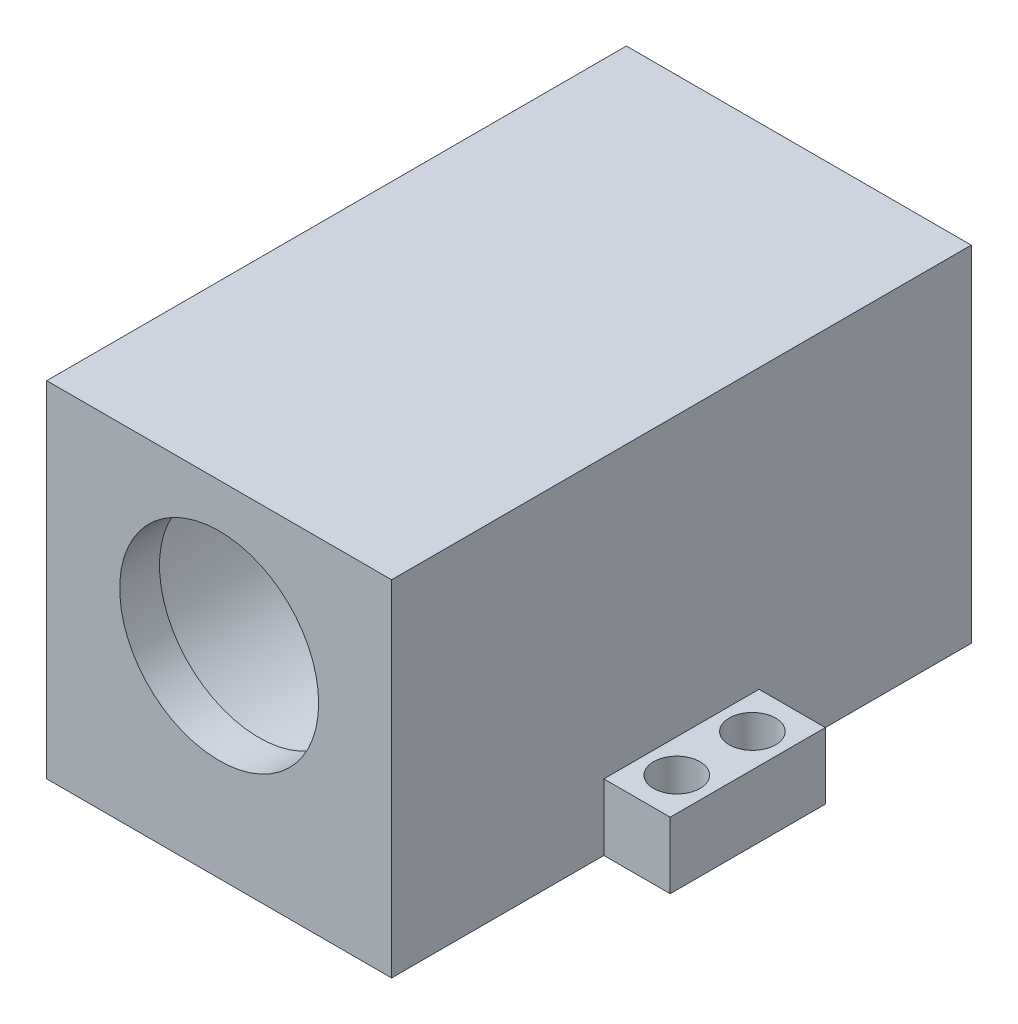
ISO-10303-21;
HEADER;
FILE_DESCRIPTION(('STEP AP214'),'2;1');
FILE_NAME('part.step','',(''),(''),'','','');
FILE_SCHEMA(('AUTOMOTIVE_DESIGN { 1 0 10303 214 1 1 1 1 }'));
ENDSEC;
DATA;
#1=APPLICATION_CONTEXT('core data for automotive mechanical design processes');
#2=APPLICATION_PROTOCOL_DEFINITION('international standard','automotive_design',2000,#1);
#3=PRODUCT_CONTEXT('',#1,'mechanical');
#4=PRODUCT('Part','Part','',(#3));
#5=PRODUCT_RELATED_PRODUCT_CATEGORY('part','',(#4));
#6=PRODUCT_DEFINITION_FORMATION('','',#4);
#7=PRODUCT_DEFINITION_CONTEXT('part definition',#1,'design');
#8=PRODUCT_DEFINITION('design','',#6,#7);
#9=PRODUCT_DEFINITION_SHAPE('','',#8);
#10=(LENGTH_UNIT() NAMED_UNIT(*) SI_UNIT(.MILLI.,.METRE.));
#11=(NAMED_UNIT(*) PLANE_ANGLE_UNIT() SI_UNIT($,.RADIAN.));
#12=(NAMED_UNIT(*) SI_UNIT($,.STERADIAN.) SOLID_ANGLE_UNIT());
#13=UNCERTAINTY_MEASURE_WITH_UNIT(LENGTH_MEASURE(1.E-05),#10,'distance_accuracy_value','');
#14=(GEOMETRIC_REPRESENTATION_CONTEXT(3) GLOBAL_UNCERTAINTY_ASSIGNED_CONTEXT((#13)) GLOBAL_UNIT_ASSIGNED_CONTEXT((#10,
#11,#12)) REPRESENTATION_CONTEXT('',''));
#15=CARTESIAN_POINT('',(0.,0.,0.));
#16=DIRECTION('',(0.,0.,1.));
#17=DIRECTION('',(1.,0.,0.));
#18=AXIS2_PLACEMENT_3D('',#15,#16,#17);
#19=CARTESIAN_POINT('',(13.,10.81,40.7));
#20=DIRECTION('',(-1.,0.,0.));
#21=DIRECTION('',(0.,-1.,0.));
#22=AXIS2_PLACEMENT_3D('',#19,#20,#21);
#23=PLANE('',#22);
#24=DIRECTION('',(0.,-1.,0.));
#25=VECTOR('',#24,1.);
#26=CARTESIAN_POINT('',(13.,-15.19,27.7));
#27=LINE('',#26,#25);
#28=CARTESIAN_POINT('',(13.,-10.19,27.7));
#29=VERTEX_POINT('',#28);
#30=CARTESIAN_POINT('',(13.,-15.19,27.7));
#31=VERTEX_POINT('',#30);
#32=EDGE_CURVE('E50',#29,#31,#27,.T.);
#33=ORIENTED_EDGE('',*,*,#32,.F.);
#34=DIRECTION('',(0.,0.,1.));
#35=VECTOR('',#34,1.);
#36=CARTESIAN_POINT('',(13.,-10.19,27.7));
#37=LINE('',#36,#35);
#38=CARTESIAN_POINT('',(13.,-10.19,16.));
#39=VERTEX_POINT('',#38);
#40=EDGE_CURVE('E143',#39,#29,#37,.T.);
#41=ORIENTED_EDGE('',*,*,#40,.F.);
#42=DIRECTION('',(0.,1.,0.));
#43=VECTOR('',#42,1.);
#44=CARTESIAN_POINT('',(13.,-15.19,16.));
#45=LINE('',#44,#43);
#46=CARTESIAN_POINT('',(13.,-15.19,16.));
#47=VERTEX_POINT('',#46);
#48=EDGE_CURVE('E56',#47,#39,#45,.T.);
#49=ORIENTED_EDGE('',*,*,#48,.F.);
#50=DIRECTION('',(0.,0.,-1.));
#51=VECTOR('',#50,1.);
#52=CARTESIAN_POINT('',(13.,-15.19,40.7));
#53=LINE('',#52,#51);
#54=CARTESIAN_POINT('',(13.,-15.19,0.));
#55=VERTEX_POINT('',#54);
#56=EDGE_CURVE('E225',#47,#55,#53,.T.);
#57=ORIENTED_EDGE('',*,*,#56,.T.);
#58=DIRECTION('',(0.,1.,0.));
#59=VECTOR('',#58,1.);
#60=CARTESIAN_POINT('',(13.,10.81,0.));
#61=LINE('',#60,#59);
#62=CARTESIAN_POINT('',(13.,10.81,0.));
#63=VERTEX_POINT('',#62);
#64=EDGE_CURVE('E215',#55,#63,#61,.T.);
#65=ORIENTED_EDGE('',*,*,#64,.T.);
#66=DIRECTION('',(0.,0.,-1.));
#67=VECTOR('',#66,1.);
#68=CARTESIAN_POINT('',(13.,10.81,40.7));
#69=LINE('',#68,#67);
#70=CARTESIAN_POINT('',(13.,10.81,43.7));
#71=VERTEX_POINT('',#70);
#72=EDGE_CURVE('E11',#71,#63,#69,.T.);
#73=ORIENTED_EDGE('',*,*,#72,.F.);
#74=DIRECTION('',(0.,1.,0.));
#75=VECTOR('',#74,1.);
#76=CARTESIAN_POINT('',(13.,10.81,43.7));
#77=LINE('',#76,#75);
#78=CARTESIAN_POINT('',(13.,-15.19,43.7));
#79=VERTEX_POINT('',#78);
#80=EDGE_CURVE('E203',#79,#71,#77,.T.);
#81=ORIENTED_EDGE('',*,*,#80,.F.);
#82=EDGE_CURVE('E226',#79,#31,#53,.T.);
#83=ORIENTED_EDGE('',*,*,#82,.T.);
#84=EDGE_LOOP('',(#33,#41,#49,#57,#65,#73,#81,#83));
#85=FACE_BOUND('',#84,.T.);
#86=ADVANCED_FACE('F36',(#85),#23,.F.);
#87=CARTESIAN_POINT('',(-13.,10.81,40.7));
#88=DIRECTION('',(1.,0.,0.));
#89=DIRECTION('',(0.,1.,0.));
#90=AXIS2_PLACEMENT_3D('',#87,#88,#89);
#91=PLANE('',#90);
#92=DIRECTION('',(0.,1.,0.));
#93=VECTOR('',#92,1.);
#94=CARTESIAN_POINT('',(-13.,-15.19,27.7));
#95=LINE('',#94,#93);
#96=CARTESIAN_POINT('',(-13.,-15.19,27.7));
#97=VERTEX_POINT('',#96);
#98=CARTESIAN_POINT('',(-13.,-10.19,27.7));
#99=VERTEX_POINT('',#98);
#100=EDGE_CURVE('E178',#97,#99,#95,.T.);
#101=ORIENTED_EDGE('',*,*,#100,.F.);
#102=DIRECTION('',(0.,0.,-1.));
#103=VECTOR('',#102,1.);
#104=CARTESIAN_POINT('',(-13.,-15.19,40.7));
#105=LINE('',#104,#103);
#106=CARTESIAN_POINT('',(-13.,-15.19,43.7));
#107=VERTEX_POINT('',#106);
#108=EDGE_CURVE('E229',#107,#97,#105,.T.);
#109=ORIENTED_EDGE('',*,*,#108,.F.);
#110=DIRECTION('',(0.,-1.,0.));
#111=VECTOR('',#110,1.);
#112=CARTESIAN_POINT('',(-13.,10.81,43.7));
#113=LINE('',#112,#111);
#114=CARTESIAN_POINT('',(-13.,10.81,43.7));
#115=VERTEX_POINT('',#114);
#116=EDGE_CURVE('E195',#115,#107,#113,.T.);
#117=ORIENTED_EDGE('',*,*,#116,.F.);
#118=DIRECTION('',(0.,0.,-1.));
#119=VECTOR('',#118,1.);
#120=CARTESIAN_POINT('',(-13.,10.81,40.7));
#121=LINE('',#120,#119);
#122=CARTESIAN_POINT('',(-13.,10.81,0.));
#123=VERTEX_POINT('',#122);
#124=EDGE_CURVE('E43',#115,#123,#121,.T.);
#125=ORIENTED_EDGE('',*,*,#124,.T.);
#126=DIRECTION('',(0.,-1.,0.));
#127=VECTOR('',#126,1.);
#128=CARTESIAN_POINT('',(-13.,10.81,0.));
#129=LINE('',#128,#127);
#130=CARTESIAN_POINT('',(-13.,-15.19,0.));
#131=VERTEX_POINT('',#130);
#132=EDGE_CURVE('E220',#123,#131,#129,.T.);
#133=ORIENTED_EDGE('',*,*,#132,.T.);
#134=CARTESIAN_POINT('',(-13.,-15.19,16.));
#135=VERTEX_POINT('',#134);
#136=EDGE_CURVE('E228',#135,#131,#105,.T.);
#137=ORIENTED_EDGE('',*,*,#136,.F.);
#138=DIRECTION('',(0.,1.,0.));
#139=VECTOR('',#138,1.);
#140=CARTESIAN_POINT('',(-13.,-15.19,16.));
#141=LINE('',#140,#139);
#142=CARTESIAN_POINT('',(-13.,-10.19,16.));
#143=VERTEX_POINT('',#142);
#144=EDGE_CURVE('E168',#135,#143,#141,.T.);
#145=ORIENTED_EDGE('',*,*,#144,.T.);
#146=DIRECTION('',(0.,0.,1.));
#147=VECTOR('',#146,1.);
#148=CARTESIAN_POINT('',(-13.,-10.19,16.));
#149=LINE('',#148,#147);
#150=EDGE_CURVE('E158',#143,#99,#149,.T.);
#151=ORIENTED_EDGE('',*,*,#150,.T.);
#152=EDGE_LOOP('',(#101,#109,#117,#125,#133,#137,#145,#151));
#153=FACE_BOUND('',#152,.T.);
#154=ADVANCED_FACE('F236',(#153),#91,.F.);
#155=CARTESIAN_POINT('',(0.,0.,0.));
#156=DIRECTION('',(0.,0.,-1.));
#157=DIRECTION('',(-1.,0.,0.));
#158=AXIS2_PLACEMENT_3D('',#155,#156,#157);
#159=PLANE('',#158);
#160=ORIENTED_EDGE('',*,*,#64,.F.);
#161=DIRECTION('',(1.,0.,0.));
#162=VECTOR('',#161,1.);
#163=CARTESIAN_POINT('',(13.,-15.19,0.));
#164=LINE('',#163,#162);
#165=EDGE_CURVE('E223',#131,#55,#164,.T.);
#166=ORIENTED_EDGE('',*,*,#165,.F.);
#167=ORIENTED_EDGE('',*,*,#132,.F.);
#168=DIRECTION('',(-1.,0.,0.));
#169=VECTOR('',#168,1.);
#170=CARTESIAN_POINT('',(13.,10.81,0.));
#171=LINE('',#170,#169);
#172=EDGE_CURVE('E218',#63,#123,#171,.T.);
#173=ORIENTED_EDGE('',*,*,#172,.F.);
#174=EDGE_LOOP('',(#160,#166,#167,#173));
#175=FACE_BOUND('',#174,.T.);
#176=CARTESIAN_POINT('',(0.,0.,0.));
#177=DIRECTION('',(0.,0.,1.));
#178=DIRECTION('',(1.,0.,0.));
#179=AXIS2_PLACEMENT_3D('',#176,#177,#178);
#180=CIRCLE('',#179,10.6);
#181=CARTESIAN_POINT('',(10.6,0.,0.));
#182=VERTEX_POINT('',#181);
#183=EDGE_CURVE('E212',#182,#182,#180,.T.);
#184=ORIENTED_EDGE('',*,*,#183,.T.);
#185=EDGE_LOOP('',(#184));
#186=FACE_BOUND('',#185,.T.);
#187=ADVANCED_FACE('F243',(#175,#186),#159,.T.);
#188=CARTESIAN_POINT('',(13.,10.81,40.7));
#189=DIRECTION('',(0.,-1.,0.));
#190=DIRECTION('',(1.,0.,0.));
#191=AXIS2_PLACEMENT_3D('',#188,#189,#190);
#192=PLANE('',#191);
#193=ORIENTED_EDGE('',*,*,#172,.T.);
#194=ORIENTED_EDGE('',*,*,#124,.F.);
#195=DIRECTION('',(-1.,0.,0.));
#196=VECTOR('',#195,1.);
#197=CARTESIAN_POINT('',(-13.,10.81,43.7));
#198=LINE('',#197,#196);
#199=EDGE_CURVE('E206',#71,#115,#198,.T.);
#200=ORIENTED_EDGE('',*,*,#199,.F.);
#201=ORIENTED_EDGE('',*,*,#72,.T.);
#202=EDGE_LOOP('',(#193,#194,#200,#201));
#203=FACE_BOUND('',#202,.T.);
#204=ADVANCED_FACE('F265',(#203),#192,.F.);
#205=CARTESIAN_POINT('',(13.,-15.19,40.7));
#206=DIRECTION('',(0.,1.,0.));
#207=DIRECTION('',(-1.,0.,0.));
#208=AXIS2_PLACEMENT_3D('',#205,#206,#207);
#209=PLANE('',#208);
#210=CARTESIAN_POINT('',(15.5,-15.19,19.));
#211=DIRECTION('',(0.,1.,0.));
#212=DIRECTION('',(-1.,0.,0.));
#213=AXIS2_PLACEMENT_3D('',#210,#211,#212);
#214=CIRCLE('',#213,1.75);
#215=CARTESIAN_POINT('',(13.75,-15.19,19.));
#216=VERTEX_POINT('',#215);
#217=EDGE_CURVE('E291',#216,#216,#214,.T.);
#218=ORIENTED_EDGE('',*,*,#217,.T.);
#219=EDGE_LOOP('',(#218));
#220=FACE_BOUND('',#219,.T.);
#221=CARTESIAN_POINT('',(15.5,-15.19,24.7));
#222=DIRECTION('',(0.,1.,0.));
#223=DIRECTION('',(-1.,0.,0.));
#224=AXIS2_PLACEMENT_3D('',#221,#222,#223);
#225=CIRCLE('',#224,1.75);
#226=CARTESIAN_POINT('',(13.75,-15.19,24.7));
#227=VERTEX_POINT('',#226);
#228=EDGE_CURVE('E295',#227,#227,#225,.T.);
#229=ORIENTED_EDGE('',*,*,#228,.T.);
#230=EDGE_LOOP('',(#229));
#231=FACE_BOUND('',#230,.T.);
#232=CARTESIAN_POINT('',(-15.4500463106623,-15.19,19.));
#233=DIRECTION('',(0.,1.,0.));
#234=DIRECTION('',(-1.,0.,0.));
#235=AXIS2_PLACEMENT_3D('',#232,#233,#234);
#236=CIRCLE('',#235,1.75);
#237=CARTESIAN_POINT('',(-17.2000463106623,-15.19,19.));
#238=VERTEX_POINT('',#237);
#239=EDGE_CURVE('E155',#238,#238,#236,.T.);
#240=ORIENTED_EDGE('',*,*,#239,.T.);
#241=EDGE_LOOP('',(#240));
#242=FACE_BOUND('',#241,.T.);
#243=CARTESIAN_POINT('',(-15.4500463106623,-15.19,24.7));
#244=DIRECTION('',(0.,1.,0.));
#245=DIRECTION('',(-1.,0.,0.));
#246=AXIS2_PLACEMENT_3D('',#243,#244,#245);
#247=CIRCLE('',#246,1.75);
#248=CARTESIAN_POINT('',(-17.2000463106623,-15.19,24.7));
#249=VERTEX_POINT('',#248);
#250=EDGE_CURVE('E146',#249,#249,#247,.T.);
#251=ORIENTED_EDGE('',*,*,#250,.T.);
#252=EDGE_LOOP('',(#251));
#253=FACE_BOUND('',#252,.T.);
#254=ORIENTED_EDGE('',*,*,#165,.T.);
#255=ORIENTED_EDGE('',*,*,#56,.F.);
#256=DIRECTION('',(-1.,0.,0.));
#257=VECTOR('',#256,1.);
#258=CARTESIAN_POINT('',(18.,-15.19,16.));
#259=LINE('',#258,#257);
#260=CARTESIAN_POINT('',(18.,-15.19,16.));
#261=VERTEX_POINT('',#260);
#262=EDGE_CURVE('E130',#261,#47,#259,.T.);
#263=ORIENTED_EDGE('',*,*,#262,.F.);
#264=DIRECTION('',(0.,0.,-1.));
#265=VECTOR('',#264,1.);
#266=CARTESIAN_POINT('',(18.,-15.19,27.7));
#267=LINE('',#266,#265);
#268=CARTESIAN_POINT('',(18.,-15.19,27.7));
#269=VERTEX_POINT('',#268);
#270=EDGE_CURVE('E123',#269,#261,#267,.T.);
#271=ORIENTED_EDGE('',*,*,#270,.F.);
#272=DIRECTION('',(-1.,0.,0.));
#273=VECTOR('',#272,1.);
#274=CARTESIAN_POINT('',(18.,-15.19,27.7));
#275=LINE('',#274,#273);
#276=EDGE_CURVE('E128',#269,#31,#275,.T.);
#277=ORIENTED_EDGE('',*,*,#276,.T.);
#278=ORIENTED_EDGE('',*,*,#82,.F.);
#279=DIRECTION('',(1.,0.,0.));
#280=VECTOR('',#279,1.);
#281=CARTESIAN_POINT('',(-13.,-15.19,43.7));
#282=LINE('',#281,#280);
#283=EDGE_CURVE('E200',#107,#79,#282,.T.);
#284=ORIENTED_EDGE('',*,*,#283,.F.);
#285=ORIENTED_EDGE('',*,*,#108,.T.);
#286=DIRECTION('',(1.,0.,0.));
#287=VECTOR('',#286,1.);
#288=CARTESIAN_POINT('',(-18.,-15.19,27.7));
#289=LINE('',#288,#287);
#290=CARTESIAN_POINT('',(-18.,-15.19,27.7));
#291=VERTEX_POINT('',#290);
#292=EDGE_CURVE('E189',#291,#97,#289,.T.);
#293=ORIENTED_EDGE('',*,*,#292,.F.);
#294=DIRECTION('',(0.,0.,1.));
#295=VECTOR('',#294,1.);
#296=CARTESIAN_POINT('',(-18.,-15.19,16.));
#297=LINE('',#296,#295);
#298=CARTESIAN_POINT('',(-18.,-15.19,16.));
#299=VERTEX_POINT('',#298);
#300=EDGE_CURVE('E170',#299,#291,#297,.T.);
#301=ORIENTED_EDGE('',*,*,#300,.F.);
#302=DIRECTION('',(1.,0.,0.));
#303=VECTOR('',#302,1.);
#304=CARTESIAN_POINT('',(-18.,-15.19,16.));
#305=LINE('',#304,#303);
#306=EDGE_CURVE('E187',#299,#135,#305,.T.);
#307=ORIENTED_EDGE('',*,*,#306,.T.);
#308=ORIENTED_EDGE('',*,*,#136,.T.);
#309=EDGE_LOOP('',(#254,#255,#263,#271,#277,#278,#284,#285,#293,#301,#307,#308));
#310=FACE_BOUND('',#309,.T.);
#311=ADVANCED_FACE('F126',(#220,#231,#242,#253,#310),#209,.F.);
#312=CARTESIAN_POINT('',(0.,0.,40.7));
#313=DIRECTION('',(0.,0.,-1.));
#314=DIRECTION('',(-1.,0.,0.));
#315=AXIS2_PLACEMENT_3D('',#312,#313,#314);
#316=CYLINDRICAL_SURFACE('',#315,10.6);
#317=CARTESIAN_POINT('',(0.,0.,40.7));
#318=DIRECTION('',(0.,0.,1.));
#319=DIRECTION('',(1.,0.,0.));
#320=AXIS2_PLACEMENT_3D('',#317,#318,#319);
#321=CIRCLE('',#320,10.6);
#322=CARTESIAN_POINT('',(10.6,0.,40.7));
#323=VERTEX_POINT('',#322);
#324=EDGE_CURVE('E209',#323,#323,#321,.T.);
#325=ORIENTED_EDGE('',*,*,#324,.T.);
#326=EDGE_LOOP('',(#325));
#327=FACE_BOUND('',#326,.T.);
#328=ORIENTED_EDGE('',*,*,#183,.F.);
#329=EDGE_LOOP('',(#328));
#330=FACE_BOUND('',#329,.T.);
#331=ADVANCED_FACE('F280',(#327,#330),#316,.F.);
#332=CARTESIAN_POINT('',(0.,0.,40.7));
#333=DIRECTION('',(0.,0.,1.));
#334=DIRECTION('',(1.,0.,0.));
#335=AXIS2_PLACEMENT_3D('',#332,#333,#334);
#336=PLANE('',#335);
#337=CARTESIAN_POINT('',(0.,0.,40.7));
#338=DIRECTION('',(0.,0.,1.));
#339=DIRECTION('',(1.,0.,0.));
#340=AXIS2_PLACEMENT_3D('',#337,#338,#339);
#341=CIRCLE('',#340,7.5);
#342=CARTESIAN_POINT('',(7.5,0.,40.7));
#343=VERTEX_POINT('',#342);
#344=EDGE_CURVE('E186',#343,#343,#341,.T.);
#345=ORIENTED_EDGE('',*,*,#344,.T.);
#346=EDGE_LOOP('',(#345));
#347=FACE_BOUND('',#346,.T.);
#348=ORIENTED_EDGE('',*,*,#324,.F.);
#349=EDGE_LOOP('',(#348));
#350=FACE_BOUND('',#349,.T.);
#351=ADVANCED_FACE('F285',(#347,#350),#336,.F.);
#352=CARTESIAN_POINT('',(0.,0.,43.7));
#353=DIRECTION('',(0.,0.,1.));
#354=DIRECTION('',(1.,0.,0.));
#355=AXIS2_PLACEMENT_3D('',#352,#353,#354);
#356=PLANE('',#355);
#357=ORIENTED_EDGE('',*,*,#116,.T.);
#358=ORIENTED_EDGE('',*,*,#283,.T.);
#359=ORIENTED_EDGE('',*,*,#80,.T.);
#360=ORIENTED_EDGE('',*,*,#199,.T.);
#361=EDGE_LOOP('',(#357,#358,#359,#360));
#362=FACE_BOUND('',#361,.T.);
#363=CARTESIAN_POINT('',(0.,0.,43.7));
#364=DIRECTION('',(0.,0.,1.));
#365=DIRECTION('',(1.,0.,0.));
#366=AXIS2_PLACEMENT_3D('',#363,#364,#365);
#367=CIRCLE('',#366,7.5);
#368=CARTESIAN_POINT('',(7.5,0.,43.7));
#369=VERTEX_POINT('',#368);
#370=EDGE_CURVE('E192',#369,#369,#367,.T.);
#371=ORIENTED_EDGE('',*,*,#370,.F.);
#372=EDGE_LOOP('',(#371));
#373=FACE_BOUND('',#372,.T.);
#374=ADVANCED_FACE('F263',(#362,#373),#356,.T.);
#375=CARTESIAN_POINT('',(0.,0.,43.7));
#376=DIRECTION('',(0.,0.,-1.));
#377=DIRECTION('',(-1.,0.,0.));
#378=AXIS2_PLACEMENT_3D('',#375,#376,#377);
#379=CYLINDRICAL_SURFACE('',#378,7.5);
#380=ORIENTED_EDGE('',*,*,#370,.T.);
#381=EDGE_LOOP('',(#380));
#382=FACE_BOUND('',#381,.T.);
#383=ORIENTED_EDGE('',*,*,#344,.F.);
#384=EDGE_LOOP('',(#383));
#385=FACE_BOUND('',#384,.T.);
#386=ADVANCED_FACE('F308',(#382,#385),#379,.F.);
#387=CARTESIAN_POINT('',(-18.,-10.19,16.));
#388=DIRECTION('',(0.,1.,0.));
#389=DIRECTION('',(-1.,0.,0.));
#390=AXIS2_PLACEMENT_3D('',#387,#388,#389);
#391=PLANE('',#390);
#392=CARTESIAN_POINT('',(-15.4500463106623,-10.19,19.));
#393=DIRECTION('',(0.,1.,0.));
#394=DIRECTION('',(-1.,0.,0.));
#395=AXIS2_PLACEMENT_3D('',#392,#393,#394);
#396=CIRCLE('',#395,1.75);
#397=CARTESIAN_POINT('',(-17.2000463106623,-10.19,19.));
#398=VERTEX_POINT('',#397);
#399=EDGE_CURVE('E159',#398,#398,#396,.T.);
#400=ORIENTED_EDGE('',*,*,#399,.F.);
#401=EDGE_LOOP('',(#400));
#402=FACE_BOUND('',#401,.T.);
#403=CARTESIAN_POINT('',(-15.4500463106623,-10.19,24.7));
#404=DIRECTION('',(0.,1.,0.));
#405=DIRECTION('',(-1.,0.,0.));
#406=AXIS2_PLACEMENT_3D('',#403,#404,#405);
#407=CIRCLE('',#406,1.75);
#408=CARTESIAN_POINT('',(-17.2000463106623,-10.19,24.7));
#409=VERTEX_POINT('',#408);
#410=EDGE_CURVE('E149',#409,#409,#407,.T.);
#411=ORIENTED_EDGE('',*,*,#410,.F.);
#412=EDGE_LOOP('',(#411));
#413=FACE_BOUND('',#412,.T.);
#414=ORIENTED_EDGE('',*,*,#150,.F.);
#415=DIRECTION('',(1.,0.,0.));
#416=VECTOR('',#415,1.);
#417=CARTESIAN_POINT('',(-18.,-10.19,16.));
#418=LINE('',#417,#416);
#419=CARTESIAN_POINT('',(-18.,-10.19,16.));
#420=VERTEX_POINT('',#419);
#421=EDGE_CURVE('E183',#420,#143,#418,.T.);
#422=ORIENTED_EDGE('',*,*,#421,.F.);
#423=DIRECTION('',(0.,0.,1.));
#424=VECTOR('',#423,1.);
#425=CARTESIAN_POINT('',(-18.,-10.19,16.));
#426=LINE('',#425,#424);
#427=CARTESIAN_POINT('',(-18.,-10.19,27.7));
#428=VERTEX_POINT('',#427);
#429=EDGE_CURVE('E164',#420,#428,#426,.T.);
#430=ORIENTED_EDGE('',*,*,#429,.T.);
#431=DIRECTION('',(1.,0.,0.));
#432=VECTOR('',#431,1.);
#433=CARTESIAN_POINT('',(-18.,-10.19,27.7));
#434=LINE('',#433,#432);
#435=EDGE_CURVE('E175',#428,#99,#434,.T.);
#436=ORIENTED_EDGE('',*,*,#435,.T.);
#437=EDGE_LOOP('',(#414,#422,#430,#436));
#438=FACE_BOUND('',#437,.T.);
#439=ADVANCED_FACE('F252',(#402,#413,#438),#391,.T.);
#440=CARTESIAN_POINT('',(-18.,-15.19,16.));
#441=DIRECTION('',(0.,0.,-1.));
#442=DIRECTION('',(-1.,0.,0.));
#443=AXIS2_PLACEMENT_3D('',#440,#441,#442);
#444=PLANE('',#443);
#445=ORIENTED_EDGE('',*,*,#144,.F.);
#446=ORIENTED_EDGE('',*,*,#306,.F.);
#447=DIRECTION('',(0.,1.,0.));
#448=VECTOR('',#447,1.);
#449=CARTESIAN_POINT('',(-18.,-15.19,16.));
#450=LINE('',#449,#448);
#451=EDGE_CURVE('E172',#299,#420,#450,.T.);
#452=ORIENTED_EDGE('',*,*,#451,.T.);
#453=ORIENTED_EDGE('',*,*,#421,.T.);
#454=EDGE_LOOP('',(#445,#446,#452,#453));
#455=FACE_BOUND('',#454,.T.);
#456=ADVANCED_FACE('F248',(#455),#444,.T.);
#457=CARTESIAN_POINT('',(-18.,-15.19,27.7));
#458=DIRECTION('',(0.,0.,-1.));
#459=DIRECTION('',(-1.,0.,0.));
#460=AXIS2_PLACEMENT_3D('',#457,#458,#459);
#461=PLANE('',#460);
#462=ORIENTED_EDGE('',*,*,#100,.T.);
#463=ORIENTED_EDGE('',*,*,#435,.F.);
#464=DIRECTION('',(0.,1.,0.));
#465=VECTOR('',#464,1.);
#466=CARTESIAN_POINT('',(-18.,-15.19,27.7));
#467=LINE('',#466,#465);
#468=EDGE_CURVE('E167',#291,#428,#467,.T.);
#469=ORIENTED_EDGE('',*,*,#468,.F.);
#470=ORIENTED_EDGE('',*,*,#292,.T.);
#471=EDGE_LOOP('',(#462,#463,#469,#470));
#472=FACE_BOUND('',#471,.T.);
#473=ADVANCED_FACE('F259',(#472),#461,.F.);
#474=CARTESIAN_POINT('',(-18.,0.,0.));
#475=DIRECTION('',(-1.,0.,0.));
#476=DIRECTION('',(0.,0.,1.));
#477=AXIS2_PLACEMENT_3D('',#474,#475,#476);
#478=PLANE('',#477);
#479=ORIENTED_EDGE('',*,*,#429,.F.);
#480=ORIENTED_EDGE('',*,*,#451,.F.);
#481=ORIENTED_EDGE('',*,*,#300,.T.);
#482=ORIENTED_EDGE('',*,*,#468,.T.);
#483=EDGE_LOOP('',(#479,#480,#481,#482));
#484=FACE_BOUND('',#483,.T.);
#485=ADVANCED_FACE('F254',(#484),#478,.T.);
#486=CARTESIAN_POINT('',(-15.4500463106623,-15.19,24.7));
#487=DIRECTION('',(0.,1.,0.));
#488=DIRECTION('',(-1.,0.,0.));
#489=AXIS2_PLACEMENT_3D('',#486,#487,#488);
#490=CYLINDRICAL_SURFACE('',#489,1.75);
#491=ORIENTED_EDGE('',*,*,#250,.F.);
#492=EDGE_LOOP('',(#491));
#493=FACE_BOUND('',#492,.T.);
#494=ORIENTED_EDGE('',*,*,#410,.T.);
#495=EDGE_LOOP('',(#494));
#496=FACE_BOUND('',#495,.T.);
#497=ADVANCED_FACE('F300',(#493,#496),#490,.F.);
#498=CARTESIAN_POINT('',(-15.4500463106623,-15.19,19.));
#499=DIRECTION('',(0.,1.,0.));
#500=DIRECTION('',(-1.,0.,0.));
#501=AXIS2_PLACEMENT_3D('',#498,#499,#500);
#502=CYLINDRICAL_SURFACE('',#501,1.75);
#503=ORIENTED_EDGE('',*,*,#239,.F.);
#504=EDGE_LOOP('',(#503));
#505=FACE_BOUND('',#504,.T.);
#506=ORIENTED_EDGE('',*,*,#399,.T.);
#507=EDGE_LOOP('',(#506));
#508=FACE_BOUND('',#507,.T.);
#509=ADVANCED_FACE('F303',(#505,#508),#502,.F.);
#510=CARTESIAN_POINT('',(18.,-15.19,27.7));
#511=DIRECTION('',(0.,0.,-1.));
#512=DIRECTION('',(-1.,0.,0.));
#513=AXIS2_PLACEMENT_3D('',#510,#511,#512);
#514=PLANE('',#513);
#515=ORIENTED_EDGE('',*,*,#32,.T.);
#516=ORIENTED_EDGE('',*,*,#276,.F.);
#517=DIRECTION('',(0.,-1.,0.));
#518=VECTOR('',#517,1.);
#519=CARTESIAN_POINT('',(18.,-15.19,27.7));
#520=LINE('',#519,#518);
#521=CARTESIAN_POINT('',(18.,-10.19,27.7));
#522=VERTEX_POINT('',#521);
#523=EDGE_CURVE('E134',#522,#269,#520,.T.);
#524=ORIENTED_EDGE('',*,*,#523,.F.);
#525=DIRECTION('',(-1.,0.,0.));
#526=VECTOR('',#525,1.);
#527=CARTESIAN_POINT('',(18.,-10.19,27.7));
#528=LINE('',#527,#526);
#529=EDGE_CURVE('E471',#522,#29,#528,.T.);
#530=ORIENTED_EDGE('',*,*,#529,.T.);
#531=EDGE_LOOP('',(#515,#516,#524,#530));
#532=FACE_BOUND('',#531,.T.);
#533=ADVANCED_FACE('F145',(#532),#514,.F.);
#534=CARTESIAN_POINT('',(18.,-15.19,16.));
#535=DIRECTION('',(0.,0.,1.));
#536=DIRECTION('',(1.,0.,0.));
#537=AXIS2_PLACEMENT_3D('',#534,#535,#536);
#538=PLANE('',#537);
#539=ORIENTED_EDGE('',*,*,#48,.T.);
#540=DIRECTION('',(-1.,0.,0.));
#541=VECTOR('',#540,1.);
#542=CARTESIAN_POINT('',(18.,-10.19,16.));
#543=LINE('',#542,#541);
#544=CARTESIAN_POINT('',(18.,-10.19,16.));
#545=VERTEX_POINT('',#544);
#546=EDGE_CURVE('E151',#545,#39,#543,.T.);
#547=ORIENTED_EDGE('',*,*,#546,.F.);
#548=DIRECTION('',(0.,1.,0.));
#549=VECTOR('',#548,1.);
#550=CARTESIAN_POINT('',(18.,-15.19,16.));
#551=LINE('',#550,#549);
#552=EDGE_CURVE('E133',#261,#545,#551,.T.);
#553=ORIENTED_EDGE('',*,*,#552,.F.);
#554=ORIENTED_EDGE('',*,*,#262,.T.);
#555=EDGE_LOOP('',(#539,#547,#553,#554));
#556=FACE_BOUND('',#555,.T.);
#557=ADVANCED_FACE('F404',(#556),#538,.F.);
#558=CARTESIAN_POINT('',(18.,-10.19,27.7));
#559=DIRECTION('',(0.,-1.,0.));
#560=DIRECTION('',(1.,0.,0.));
#561=AXIS2_PLACEMENT_3D('',#558,#559,#560);
#562=PLANE('',#561);
#563=CARTESIAN_POINT('',(15.5,-10.19,19.));
#564=DIRECTION('',(0.,1.,0.));
#565=DIRECTION('',(-1.,0.,0.));
#566=AXIS2_PLACEMENT_3D('',#563,#564,#565);
#567=CIRCLE('',#566,1.75);
#568=CARTESIAN_POINT('',(13.75,-10.19,19.));
#569=VERTEX_POINT('',#568);
#570=EDGE_CURVE('E461',#569,#569,#567,.T.);
#571=ORIENTED_EDGE('',*,*,#570,.F.);
#572=EDGE_LOOP('',(#571));
#573=FACE_BOUND('',#572,.T.);
#574=CARTESIAN_POINT('',(15.5,-10.19,24.7));
#575=DIRECTION('',(0.,1.,0.));
#576=DIRECTION('',(-1.,0.,0.));
#577=AXIS2_PLACEMENT_3D('',#574,#575,#576);
#578=CIRCLE('',#577,1.75);
#579=CARTESIAN_POINT('',(13.75,-10.19,24.7));
#580=VERTEX_POINT('',#579);
#581=EDGE_CURVE('E464',#580,#580,#578,.T.);
#582=ORIENTED_EDGE('',*,*,#581,.F.);
#583=EDGE_LOOP('',(#582));
#584=FACE_BOUND('',#583,.T.);
#585=ORIENTED_EDGE('',*,*,#40,.T.);
#586=ORIENTED_EDGE('',*,*,#529,.F.);
#587=DIRECTION('',(0.,0.,1.));
#588=VECTOR('',#587,1.);
#589=CARTESIAN_POINT('',(18.,-10.19,27.7));
#590=LINE('',#589,#588);
#591=EDGE_CURVE('E139',#545,#522,#590,.T.);
#592=ORIENTED_EDGE('',*,*,#591,.F.);
#593=ORIENTED_EDGE('',*,*,#546,.T.);
#594=EDGE_LOOP('',(#585,#586,#592,#593));
#595=FACE_BOUND('',#594,.T.);
#596=ADVANCED_FACE('F413',(#573,#584,#595),#562,.F.);
#597=CARTESIAN_POINT('',(18.,0.,0.));
#598=DIRECTION('',(-1.,0.,0.));
#599=DIRECTION('',(0.,0.,1.));
#600=AXIS2_PLACEMENT_3D('',#597,#598,#599);
#601=PLANE('',#600);
#602=ORIENTED_EDGE('',*,*,#523,.T.);
#603=ORIENTED_EDGE('',*,*,#270,.T.);
#604=ORIENTED_EDGE('',*,*,#552,.T.);
#605=ORIENTED_EDGE('',*,*,#591,.T.);
#606=EDGE_LOOP('',(#602,#603,#604,#605));
#607=FACE_BOUND('',#606,.T.);
#608=ADVANCED_FACE('F137',(#607),#601,.F.);
#609=CARTESIAN_POINT('',(15.5,-15.19,24.7));
#610=DIRECTION('',(0.,1.,0.));
#611=DIRECTION('',(-1.,0.,0.));
#612=AXIS2_PLACEMENT_3D('',#609,#610,#611);
#613=CYLINDRICAL_SURFACE('',#612,1.75);
#614=ORIENTED_EDGE('',*,*,#228,.F.);
#615=EDGE_LOOP('',(#614));
#616=FACE_BOUND('',#615,.T.);
#617=ORIENTED_EDGE('',*,*,#581,.T.);
#618=EDGE_LOOP('',(#617));
#619=FACE_BOUND('',#618,.T.);
#620=ADVANCED_FACE('F424',(#616,#619),#613,.F.);
#621=CARTESIAN_POINT('',(15.5,-15.19,19.));
#622=DIRECTION('',(0.,1.,0.));
#623=DIRECTION('',(-1.,0.,0.));
#624=AXIS2_PLACEMENT_3D('',#621,#622,#623);
#625=CYLINDRICAL_SURFACE('',#624,1.75);
#626=ORIENTED_EDGE('',*,*,#217,.F.);
#627=EDGE_LOOP('',(#626));
#628=FACE_BOUND('',#627,.T.);
#629=ORIENTED_EDGE('',*,*,#570,.T.);
#630=EDGE_LOOP('',(#629));
#631=FACE_BOUND('',#630,.T.);
#632=ADVANCED_FACE('F444',(#628,#631),#625,.F.);
#633=CLOSED_SHELL('',(#86,#154,#187,#204,#311,#331,#351,#374,#386,#439,#456,#473,#485,#497,#509,
#533,#557,#596,#608,#620,#632));
#634=MANIFOLD_SOLID_BREP('B2',#633);
#635=ADVANCED_BREP_SHAPE_REPRESENTATION('',(#18,#634),#14);
#636=SHAPE_DEFINITION_REPRESENTATION(#9,#635);
ENDSEC;
END-ISO-10303-21;
